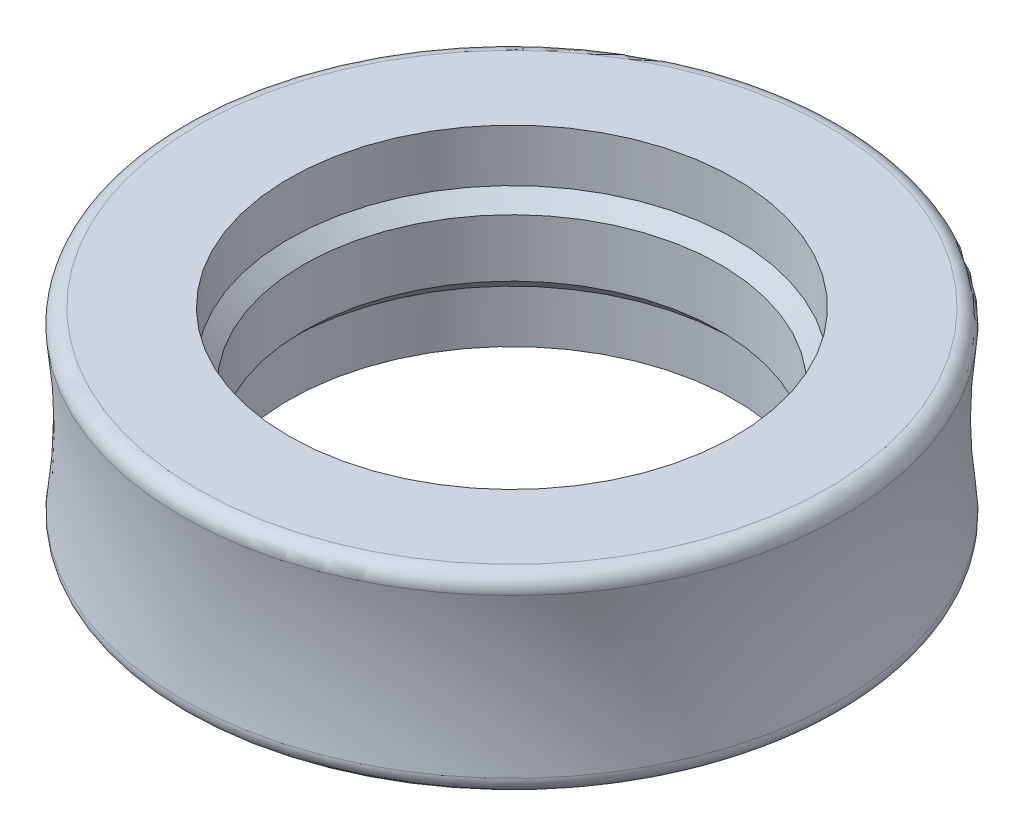
ISO-10303-21;
HEADER;
FILE_DESCRIPTION(('STEP AP214'),'2;1');
FILE_NAME('part.step','',(''),(''),'','','');
FILE_SCHEMA(('AUTOMOTIVE_DESIGN { 1 0 10303 214 1 1 1 1 }'));
ENDSEC;
DATA;
#1=APPLICATION_CONTEXT('core data for automotive mechanical design processes');
#2=APPLICATION_PROTOCOL_DEFINITION('international standard','automotive_design',2000,#1);
#3=PRODUCT_CONTEXT('',#1,'mechanical');
#4=PRODUCT('Part','Part','',(#3));
#5=PRODUCT_RELATED_PRODUCT_CATEGORY('part','',(#4));
#6=PRODUCT_DEFINITION_FORMATION('','',#4);
#7=PRODUCT_DEFINITION_CONTEXT('part definition',#1,'design');
#8=PRODUCT_DEFINITION('design','',#6,#7);
#9=PRODUCT_DEFINITION_SHAPE('','',#8);
#10=(LENGTH_UNIT() NAMED_UNIT(*) SI_UNIT(.MILLI.,.METRE.));
#11=(NAMED_UNIT(*) PLANE_ANGLE_UNIT() SI_UNIT($,.RADIAN.));
#12=(NAMED_UNIT(*) SI_UNIT($,.STERADIAN.) SOLID_ANGLE_UNIT());
#13=UNCERTAINTY_MEASURE_WITH_UNIT(LENGTH_MEASURE(1.E-05),#10,'distance_accuracy_value','');
#14=(GEOMETRIC_REPRESENTATION_CONTEXT(3) GLOBAL_UNCERTAINTY_ASSIGNED_CONTEXT((#13)) GLOBAL_UNIT_ASSIGNED_CONTEXT((#10,
#11,#12)) REPRESENTATION_CONTEXT('',''));
#15=CARTESIAN_POINT('',(0.,0.,0.));
#16=DIRECTION('',(0.,0.,1.));
#17=DIRECTION('',(1.,0.,0.));
#18=AXIS2_PLACEMENT_3D('',#15,#16,#17);
#19=CARTESIAN_POINT('',(0.,6.5,0.));
#20=DIRECTION('',(0.,1.,0.));
#21=DIRECTION('',(0.,0.,1.));
#22=AXIS2_PLACEMENT_3D('',#19,#20,#21);
#23=PLANE('',#22);
#24=CARTESIAN_POINT('',(0.,6.5,0.));
#25=DIRECTION('',(0.,1.,0.));
#26=DIRECTION('',(0.,0.,1.));
#27=AXIS2_PLACEMENT_3D('',#24,#25,#26);
#28=CIRCLE('',#27,21.3389189075654);
#29=CARTESIAN_POINT('',(0.,6.5,21.3389189075654));
#30=VERTEX_POINT('',#29);
#31=EDGE_CURVE('E143',#30,#30,#28,.T.);
#32=ORIENTED_EDGE('',*,*,#31,.T.);
#33=EDGE_LOOP('',(#32));
#34=FACE_BOUND('',#33,.T.);
#35=CARTESIAN_POINT('',(0.,6.5,0.));
#36=DIRECTION('',(0.,1.,0.));
#37=DIRECTION('',(0.,0.,1.));
#38=AXIS2_PLACEMENT_3D('',#35,#36,#37);
#39=CIRCLE('',#38,15.125);
#40=CARTESIAN_POINT('',(0.,6.5,15.125));
#41=VERTEX_POINT('',#40);
#42=EDGE_CURVE('E121',#41,#41,#39,.T.);
#43=ORIENTED_EDGE('',*,*,#42,.F.);
#44=EDGE_LOOP('',(#43));
#45=FACE_BOUND('',#44,.T.);
#46=ADVANCED_FACE('F49',(#34,#45),#23,.T.);
#47=CARTESIAN_POINT('',(0.,-6.5,0.));
#48=DIRECTION('',(0.,1.,0.));
#49=DIRECTION('',(0.,0.,1.));
#50=AXIS2_PLACEMENT_3D('',#47,#48,#49);
#51=PLANE('',#50);
#52=CARTESIAN_POINT('',(0.,-6.5,0.));
#53=DIRECTION('',(0.,1.,0.));
#54=DIRECTION('',(0.,0.,1.));
#55=AXIS2_PLACEMENT_3D('',#52,#53,#54);
#56=CIRCLE('',#55,21.3389189075654);
#57=CARTESIAN_POINT('',(0.,-6.5,21.3389189075654));
#58=VERTEX_POINT('',#57);
#59=EDGE_CURVE('E139',#58,#58,#56,.F.);
#60=ORIENTED_EDGE('',*,*,#59,.T.);
#61=EDGE_LOOP('',(#60));
#62=FACE_BOUND('',#61,.T.);
#63=CARTESIAN_POINT('',(0.,-6.5,0.));
#64=DIRECTION('',(0.,1.,0.));
#65=DIRECTION('',(0.,0.,1.));
#66=AXIS2_PLACEMENT_3D('',#63,#64,#65);
#67=CIRCLE('',#66,15.125);
#68=CARTESIAN_POINT('',(0.,-6.5,15.125));
#69=VERTEX_POINT('',#68);
#70=EDGE_CURVE('E128',#69,#69,#67,.T.);
#71=ORIENTED_EDGE('',*,*,#70,.T.);
#72=EDGE_LOOP('',(#71));
#73=FACE_BOUND('',#72,.T.);
#74=ADVANCED_FACE('F181',(#62,#73),#51,.F.);
#75=CARTESIAN_POINT('',(0.,6.5,0.));
#76=DIRECTION('',(0.,-1.,0.));
#77=DIRECTION('',(0.,0.,-1.));
#78=AXIS2_PLACEMENT_3D('',#75,#76,#77);
#79=CYLINDRICAL_SURFACE('',#78,15.125);
#80=ORIENTED_EDGE('',*,*,#70,.F.);
#81=EDGE_LOOP('',(#80));
#82=FACE_BOUND('',#81,.T.);
#83=CARTESIAN_POINT('',(0.,2.94999999999999,0.));
#84=DIRECTION('',(0.,1.,0.));
#85=DIRECTION('',(0.,0.,1.));
#86=AXIS2_PLACEMENT_3D('',#83,#84,#85);
#87=CIRCLE('',#86,15.125);
#88=CARTESIAN_POINT('',(14.9084917077483,2.94999999999998,2.55));
#89=VERTEX_POINT('',#88);
#90=CARTESIAN_POINT('',(14.9084917077483,2.94999999999998,-2.55));
#91=VERTEX_POINT('',#90);
#92=EDGE_CURVE('E120',#89,#91,#87,.F.);
#93=ORIENTED_EDGE('',*,*,#92,.T.);
#94=DIRECTION('',(0.,1.,0.));
#95=VECTOR('',#94,1.);
#96=CARTESIAN_POINT('',(14.9084917077483,-6.5,-2.55));
#97=LINE('',#96,#95);
#98=CARTESIAN_POINT('',(14.9084917077483,-2.95000000000004,-2.55));
#99=VERTEX_POINT('',#98);
#100=EDGE_CURVE('E102',#99,#91,#97,.T.);
#101=ORIENTED_EDGE('',*,*,#100,.F.);
#102=CARTESIAN_POINT('',(0.,-2.95000000000004,0.));
#103=DIRECTION('',(0.,1.,0.));
#104=DIRECTION('',(0.,0.,1.));
#105=AXIS2_PLACEMENT_3D('',#102,#103,#104);
#106=CIRCLE('',#105,15.125);
#107=CARTESIAN_POINT('',(14.9084917077483,-2.95000000000004,2.55));
#108=VERTEX_POINT('',#107);
#109=EDGE_CURVE('E109',#99,#108,#106,.T.);
#110=ORIENTED_EDGE('',*,*,#109,.T.);
#111=DIRECTION('',(0.,1.,0.));
#112=VECTOR('',#111,1.);
#113=CARTESIAN_POINT('',(14.9084917077483,-6.5,2.55));
#114=LINE('',#113,#112);
#115=EDGE_CURVE('E93',#108,#89,#114,.T.);
#116=ORIENTED_EDGE('',*,*,#115,.T.);
#117=EDGE_LOOP('',(#93,#101,#110,#116));
#118=FACE_BOUND('',#117,.T.);
#119=ORIENTED_EDGE('',*,*,#42,.T.);
#120=EDGE_LOOP('',(#119));
#121=FACE_BOUND('',#120,.T.);
#122=ADVANCED_FACE('F117',(#82,#118,#121),#79,.F.);
#123=CARTESIAN_POINT('',(0.,1.95,0.));
#124=DIRECTION('',(0.,-1.,0.));
#125=DIRECTION('',(0.,0.,-1.));
#126=AXIS2_PLACEMENT_3D('',#123,#124,#125);
#127=CYLINDRICAL_SURFACE('',#126,14.125);
#128=DIRECTION('',(0.,1.,0.));
#129=VECTOR('',#128,1.);
#130=CARTESIAN_POINT('',(13.8929163605054,-6.5,-2.55));
#131=LINE('',#130,#129);
#132=CARTESIAN_POINT('',(13.8929163605054,-1.95000000000002,-2.55));
#133=VERTEX_POINT('',#132);
#134=CARTESIAN_POINT('',(13.8929163605054,1.94999999999999,-2.55));
#135=VERTEX_POINT('',#134);
#136=EDGE_CURVE('E114',#133,#135,#131,.T.);
#137=ORIENTED_EDGE('',*,*,#136,.T.);
#138=CARTESIAN_POINT('',(0.,1.95,0.));
#139=DIRECTION('',(0.,1.,0.));
#140=DIRECTION('',(0.,0.,1.));
#141=AXIS2_PLACEMENT_3D('',#138,#139,#140);
#142=CIRCLE('',#141,14.125);
#143=CARTESIAN_POINT('',(13.8929163605054,1.95,2.55));
#144=VERTEX_POINT('',#143);
#145=EDGE_CURVE('E200',#135,#144,#142,.T.);
#146=ORIENTED_EDGE('',*,*,#145,.T.);
#147=DIRECTION('',(0.,1.,0.));
#148=VECTOR('',#147,1.);
#149=CARTESIAN_POINT('',(13.8929163605054,-6.5,2.55));
#150=LINE('',#149,#148);
#151=CARTESIAN_POINT('',(13.8929163605054,-1.95000000000002,2.55));
#152=VERTEX_POINT('',#151);
#153=EDGE_CURVE('E71',#152,#144,#150,.T.);
#154=ORIENTED_EDGE('',*,*,#153,.F.);
#155=CARTESIAN_POINT('',(0.,-1.95,0.));
#156=DIRECTION('',(0.,1.,0.));
#157=DIRECTION('',(0.,0.,1.));
#158=AXIS2_PLACEMENT_3D('',#155,#156,#157);
#159=CIRCLE('',#158,14.125);
#160=EDGE_CURVE('E111',#133,#152,#159,.T.);
#161=ORIENTED_EDGE('',*,*,#160,.F.);
#162=EDGE_LOOP('',(#137,#146,#154,#161));
#163=FACE_BOUND('',#162,.T.);
#164=ADVANCED_FACE('F190',(#163),#127,.F.);
#165=CARTESIAN_POINT('',(0.,0.,0.));
#166=DIRECTION('',(0.,1.,0.));
#167=DIRECTION('',(-1.,0.,0.));
#168=AXIS2_PLACEMENT_3D('',#165,#166,#167);
#169=TOROIDAL_SURFACE('',#168,61.9683417437318,40.);
#170=CARTESIAN_POINT('',(0.,-5.36585365853658,0.));
#171=DIRECTION('',(0.,1.,0.));
#172=DIRECTION('',(0.,0.,1.));
#173=AXIS2_PLACEMENT_3D('',#170,#171,#172);
#174=CIRCLE('',#173,22.3298804401548);
#175=CARTESIAN_POINT('',(0.,-5.36585365853658,22.3298804401548));
#176=VERTEX_POINT('',#175);
#177=EDGE_CURVE('E135',#176,#176,#174,.T.);
#178=ORIENTED_EDGE('',*,*,#177,.T.);
#179=EDGE_LOOP('',(#178));
#180=FACE_BOUND('',#179,.T.);
#181=CARTESIAN_POINT('',(0.,5.36585365853659,0.));
#182=DIRECTION('',(0.,-1.,0.));
#183=DIRECTION('',(0.,0.,-1.));
#184=AXIS2_PLACEMENT_3D('',#181,#182,#183);
#185=CIRCLE('',#184,22.3298804401548);
#186=CARTESIAN_POINT('',(0.,5.36585365853659,-22.3298804401548));
#187=VERTEX_POINT('',#186);
#188=EDGE_CURVE('E125',#187,#187,#185,.T.);
#189=ORIENTED_EDGE('',*,*,#188,.T.);
#190=EDGE_LOOP('',(#189));
#191=FACE_BOUND('',#190,.T.);
#192=ADVANCED_FACE('F161',(#180,#191),#169,.F.);
#193=CARTESIAN_POINT('',(0.,-2.95000000000004,0.));
#194=DIRECTION('',(0.,-1.,0.));
#195=DIRECTION('',(0.,0.,-1.));
#196=AXIS2_PLACEMENT_3D('',#193,#194,#195);
#197=CONICAL_SURFACE('',#196,15.125,0.785398163397439);
#198=ORIENTED_EDGE('',*,*,#109,.F.);
#199=CARTESIAN_POINT('',(16.3339612562645,-4.35681146520706,-2.55));
#200=CARTESIAN_POINT('',(16.0123315776901,-4.03903476050738,-2.55));
#201=CARTESIAN_POINT('',(15.6905939439714,-3.72136724059894,-2.55));
#202=CARTESIAN_POINT('',(15.0468507664786,-3.08630448446958,-2.55));
#203=CARTESIAN_POINT('',(14.7248452229949,-2.76890924795438,-2.55));
#204=CARTESIAN_POINT('',(14.0805134058201,-2.13444416211882,-2.55));
#205=CARTESIAN_POINT('',(13.7581871320053,-1.81737431292428,-2.55));
#206=CARTESIAN_POINT('',(13.1131356151733,-1.18364004087323,-2.55));
#207=CARTESIAN_POINT('',(12.7904103717231,-0.866975618457713,-2.55));
#208=CARTESIAN_POINT('',(12.4674468119893,-0.550554212284078,-2.55));
#209=B_SPLINE_CURVE_WITH_KNOTS('',3,(#199,#200,#201,#202,#203,#204,#205,#206,#207,#208),
.UNSPECIFIED.,.F.,.F.,(4,2,2,2,4),(0.,1.35641044636288,2.71281942495556,4.06922892790226,
5.42563990500059),.UNSPECIFIED.);
#210=EDGE_CURVE('E113',#99,#133,#209,.T.);
#211=ORIENTED_EDGE('',*,*,#210,.T.);
#212=ORIENTED_EDGE('',*,*,#160,.T.);
#213=CARTESIAN_POINT('',(12.4674468119893,-0.550554212284081,2.55));
#214=CARTESIAN_POINT('',(12.7904103717231,-0.866975618457714,2.55));
#215=CARTESIAN_POINT('',(13.1131356151733,-1.18364004087323,2.55));
#216=CARTESIAN_POINT('',(13.7581871320053,-1.81737431292428,2.55));
#217=CARTESIAN_POINT('',(14.0805134058201,-2.13444416211882,2.55));
#218=CARTESIAN_POINT('',(14.7248452229949,-2.76890924795438,2.55));
#219=CARTESIAN_POINT('',(15.0468507664786,-3.08630448446958,2.55));
#220=CARTESIAN_POINT('',(15.6905939439714,-3.72136724059894,2.55));
#221=CARTESIAN_POINT('',(16.0123315776901,-4.03903476050738,2.55));
#222=CARTESIAN_POINT('',(16.3339612562645,-4.35681146520706,2.55));
#223=B_SPLINE_CURVE_WITH_KNOTS('',3,(#213,#214,#215,#216,#217,#218,#219,#220,#221,#222),
.UNSPECIFIED.,.F.,.F.,(4,2,2,2,4),(0.,1.35641097709833,2.71282048004504,4.06922945863771,
5.42563990500059),.UNSPECIFIED.);
#224=EDGE_CURVE('E96',#152,#108,#223,.T.);
#225=ORIENTED_EDGE('',*,*,#224,.T.);
#226=EDGE_LOOP('',(#198,#211,#212,#225));
#227=FACE_BOUND('',#226,.T.);
#228=ADVANCED_FACE('F107',(#227),#197,.F.);
#229=CARTESIAN_POINT('',(0.,1.95,0.));
#230=DIRECTION('',(0.,1.,0.));
#231=DIRECTION('',(0.,0.,1.));
#232=AXIS2_PLACEMENT_3D('',#229,#230,#231);
#233=CONICAL_SURFACE('',#232,14.125,0.78539816339745);
#234=ORIENTED_EDGE('',*,*,#145,.F.);
#235=CARTESIAN_POINT('',(12.4674468119893,0.550554212284115,-2.55));
#236=CARTESIAN_POINT('',(12.7904103717231,0.866975618457735,-2.55));
#237=CARTESIAN_POINT('',(13.1131356151734,1.18364004087324,-2.55));
#238=CARTESIAN_POINT('',(13.7581871320053,1.81737431292426,-2.55));
#239=CARTESIAN_POINT('',(14.0805134058201,2.13444416211878,-2.55));
#240=CARTESIAN_POINT('',(14.7248452229948,2.76890924795432,-2.55));
#241=CARTESIAN_POINT('',(15.0468507664786,3.08630448446951,-2.55));
#242=CARTESIAN_POINT('',(15.6905939439714,3.72136724059884,-2.55));
#243=CARTESIAN_POINT('',(16.01233157769,4.03903476050727,-2.55));
#244=CARTESIAN_POINT('',(16.3339612562645,4.35681146520694,-2.55));
#245=B_SPLINE_CURVE_WITH_KNOTS('',3,(#235,#236,#237,#238,#239,#240,#241,#242,#243,#244),
.UNSPECIFIED.,.F.,.F.,(4,2,2,2,4),(0.,1.35641097709829,2.71282048004495,4.06922945863758,
5.42563990500042),.UNSPECIFIED.);
#246=EDGE_CURVE('E11',#135,#91,#245,.T.);
#247=ORIENTED_EDGE('',*,*,#246,.T.);
#248=ORIENTED_EDGE('',*,*,#92,.F.);
#249=CARTESIAN_POINT('',(16.3339612562645,4.35681146520694,2.55));
#250=CARTESIAN_POINT('',(16.01233157769,4.03903476050727,2.55));
#251=CARTESIAN_POINT('',(15.6905939439714,3.72136724059884,2.55));
#252=CARTESIAN_POINT('',(15.0468507664786,3.08630448446951,2.55));
#253=CARTESIAN_POINT('',(14.7248452229948,2.76890924795432,2.55));
#254=CARTESIAN_POINT('',(14.0805134058201,2.13444416211878,2.55));
#255=CARTESIAN_POINT('',(13.7581871320053,1.81737431292426,2.55));
#256=CARTESIAN_POINT('',(13.1131356151734,1.18364004087324,2.55));
#257=CARTESIAN_POINT('',(12.7904103717231,0.866975618457735,2.55));
#258=CARTESIAN_POINT('',(12.4674468119893,0.550554212284115,2.55));
#259=B_SPLINE_CURVE_WITH_KNOTS('',3,(#249,#250,#251,#252,#253,#254,#255,#256,#257,#258),
.UNSPECIFIED.,.F.,.F.,(4,2,2,2,4),(0.,1.35641044636284,2.71281942495547,4.06922892790214,
5.42563990500043),.UNSPECIFIED.);
#260=EDGE_CURVE('E64',#89,#144,#259,.T.);
#261=ORIENTED_EDGE('',*,*,#260,.T.);
#262=EDGE_LOOP('',(#234,#247,#248,#261));
#263=FACE_BOUND('',#262,.T.);
#264=ADVANCED_FACE('F153',(#263),#233,.F.);
#265=CARTESIAN_POINT('',(0.,-5.5,0.));
#266=DIRECTION('',(0.,-1.,0.));
#267=DIRECTION('',(0.,0.,-1.));
#268=AXIS2_PLACEMENT_3D('',#265,#266,#267);
#269=TOROIDAL_SURFACE('',#268,21.3389189075654,1.);
#270=ORIENTED_EDGE('',*,*,#59,.F.);
#271=EDGE_LOOP('',(#270));
#272=FACE_BOUND('',#271,.T.);
#273=ORIENTED_EDGE('',*,*,#177,.F.);
#274=EDGE_LOOP('',(#273));
#275=FACE_BOUND('',#274,.T.);
#276=ADVANCED_FACE('F218',(#272,#275),#269,.T.);
#277=CARTESIAN_POINT('',(0.,5.5,0.));
#278=DIRECTION('',(0.,-1.,0.));
#279=DIRECTION('',(0.,0.,-1.));
#280=AXIS2_PLACEMENT_3D('',#277,#278,#279);
#281=TOROIDAL_SURFACE('',#280,21.3389189075654,1.);
#282=ORIENTED_EDGE('',*,*,#188,.F.);
#283=EDGE_LOOP('',(#282));
#284=FACE_BOUND('',#283,.T.);
#285=ORIENTED_EDGE('',*,*,#31,.F.);
#286=EDGE_LOOP('',(#285));
#287=FACE_BOUND('',#286,.T.);
#288=ADVANCED_FACE('F51',(#284,#287),#281,.T.);
#289=CARTESIAN_POINT('',(13.8929163605054,-6.5,-2.55));
#290=DIRECTION('',(0.,0.,-1.));
#291=DIRECTION('',(-1.,0.,0.));
#292=AXIS2_PLACEMENT_3D('',#289,#290,#291);
#293=PLANE('',#292);
#294=ORIENTED_EDGE('',*,*,#100,.T.);
#295=ORIENTED_EDGE('',*,*,#246,.F.);
#296=ORIENTED_EDGE('',*,*,#136,.F.);
#297=ORIENTED_EDGE('',*,*,#210,.F.);
#298=EDGE_LOOP('',(#294,#295,#296,#297));
#299=FACE_BOUND('',#298,.T.);
#300=ADVANCED_FACE('F159',(#299),#293,.F.);
#301=CARTESIAN_POINT('',(14.9084917077483,-6.5,2.55));
#302=DIRECTION('',(0.,0.,1.));
#303=DIRECTION('',(1.,0.,0.));
#304=AXIS2_PLACEMENT_3D('',#301,#302,#303);
#305=PLANE('',#304);
#306=ORIENTED_EDGE('',*,*,#153,.T.);
#307=ORIENTED_EDGE('',*,*,#260,.F.);
#308=ORIENTED_EDGE('',*,*,#115,.F.);
#309=ORIENTED_EDGE('',*,*,#224,.F.);
#310=EDGE_LOOP('',(#306,#307,#308,#309));
#311=FACE_BOUND('',#310,.T.);
#312=ADVANCED_FACE('F95',(#311),#305,.F.);
#313=CLOSED_SHELL('',(#46,#74,#122,#164,#192,#228,#264,#276,#288,#300,#312));
#314=MANIFOLD_SOLID_BREP('B2',#313);
#315=ADVANCED_BREP_SHAPE_REPRESENTATION('',(#18,#314),#14);
#316=SHAPE_DEFINITION_REPRESENTATION(#9,#315);
ENDSEC;
END-ISO-10303-21;
